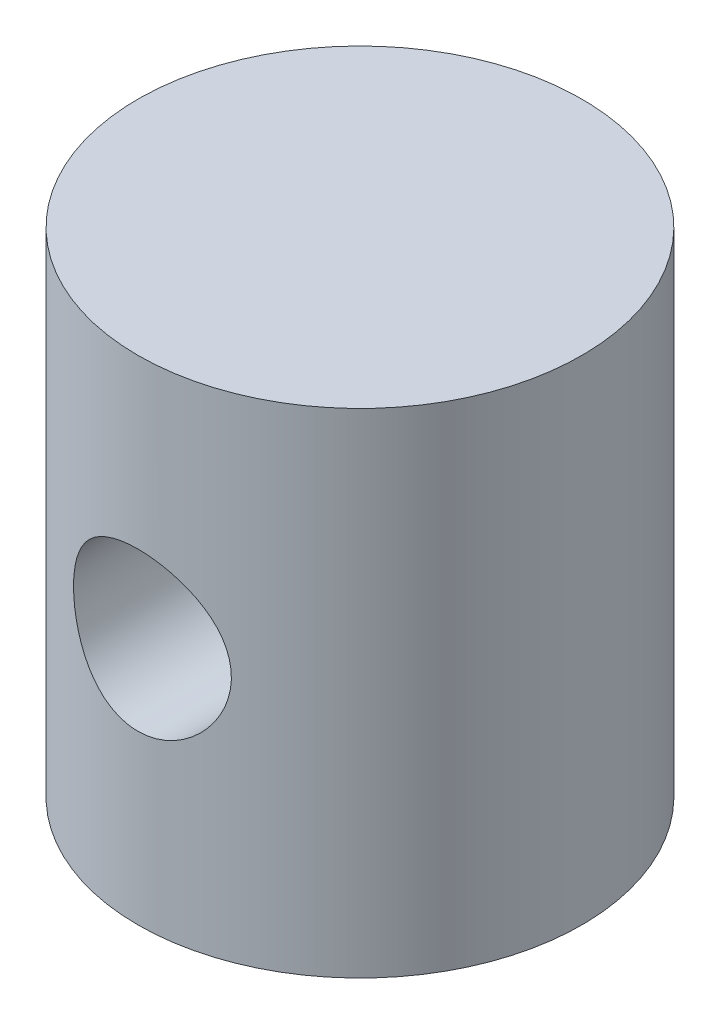
ISO-10303-21;
HEADER;
FILE_DESCRIPTION(('STEP AP214'),'2;1');
FILE_NAME('part.step','',(''),(''),'','','');
FILE_SCHEMA(('AUTOMOTIVE_DESIGN { 1 0 10303 214 1 1 1 1 }'));
ENDSEC;
DATA;
#1=APPLICATION_CONTEXT('core data for automotive mechanical design processes');
#2=APPLICATION_PROTOCOL_DEFINITION('international standard','automotive_design',2000,#1);
#3=PRODUCT_CONTEXT('',#1,'mechanical');
#4=PRODUCT('Part','Part','',(#3));
#5=PRODUCT_RELATED_PRODUCT_CATEGORY('part','',(#4));
#6=PRODUCT_DEFINITION_FORMATION('','',#4);
#7=PRODUCT_DEFINITION_CONTEXT('part definition',#1,'design');
#8=PRODUCT_DEFINITION('design','',#6,#7);
#9=PRODUCT_DEFINITION_SHAPE('','',#8);
#10=(LENGTH_UNIT() NAMED_UNIT(*) SI_UNIT(.MILLI.,.METRE.));
#11=(NAMED_UNIT(*) PLANE_ANGLE_UNIT() SI_UNIT($,.RADIAN.));
#12=(NAMED_UNIT(*) SI_UNIT($,.STERADIAN.) SOLID_ANGLE_UNIT());
#13=UNCERTAINTY_MEASURE_WITH_UNIT(LENGTH_MEASURE(1.E-05),#10,'distance_accuracy_value','');
#14=(GEOMETRIC_REPRESENTATION_CONTEXT(3) GLOBAL_UNCERTAINTY_ASSIGNED_CONTEXT((#13)) GLOBAL_UNIT_ASSIGNED_CONTEXT((#10,
#11,#12)) REPRESENTATION_CONTEXT('',''));
#15=CARTESIAN_POINT('',(0.,0.,0.));
#16=DIRECTION('',(0.,0.,1.));
#17=DIRECTION('',(1.,0.,0.));
#18=AXIS2_PLACEMENT_3D('',#15,#16,#17);
#19=CARTESIAN_POINT('',(0.,10.,0.));
#20=DIRECTION('',(0.,-1.,0.));
#21=DIRECTION('',(0.,0.,-1.));
#22=AXIS2_PLACEMENT_3D('',#19,#20,#21);
#23=CYLINDRICAL_SURFACE('',#22,4.5);
#24=CARTESIAN_POINT('',(0.,6.6,-4.5));
#25=CARTESIAN_POINT('',(-0.086962367001016,6.60000170331781,-4.50000121831381));
#26=CARTESIAN_POINT('',(-0.173912594986548,6.59288756464758,-4.49745660218462));
#27=CARTESIAN_POINT('',(-0.345232042730816,6.56472052458813,-4.48755808036336));
#28=CARTESIAN_POINT('',(-0.429601336499045,6.54366802328069,-4.48020431271152));
#29=CARTESIAN_POINT('',(-0.593264268083103,6.48845103202088,-4.46148154327846));
#30=CARTESIAN_POINT('',(-0.672566778801104,6.45431023971096,-4.45011980128102));
#31=CARTESIAN_POINT('',(-0.824317203344214,6.37399991762724,-4.42452601410756));
#32=CARTESIAN_POINT('',(-0.896763487837446,6.32782753837109,-4.41029328916733));
#33=CARTESIAN_POINT('',(-1.03555325603972,6.22289019225377,-4.37982378915437));
#34=CARTESIAN_POINT('',(-1.10159500304409,6.16374155564854,-4.36353436231253));
#35=CARTESIAN_POINT('',(-1.22305889816077,6.03534558248293,-4.33106075441773));
#36=CARTESIAN_POINT('',(-1.27847825467449,5.96609559965348,-4.31487660210787));
#37=CARTESIAN_POINT('',(-1.37894735362518,5.81662639239243,-4.28384961832896));
#38=CARTESIAN_POINT('',(-1.42358728446997,5.73611730849917,-4.26906992427759));
#39=CARTESIAN_POINT('',(-1.49856138439723,5.56812467914551,-4.24333556181675));
#40=CARTESIAN_POINT('',(-1.52890061337281,5.48064361334812,-4.23237954086694));
#41=CARTESIAN_POINT('',(-1.57324906446977,5.30464586475907,-4.2160917852771));
#42=CARTESIAN_POINT('',(-1.58782943631511,5.21629181674756,-4.21056405508782));
#43=CARTESIAN_POINT('',(-1.60203228750589,5.03823163484607,-4.2051820306007));
#44=CARTESIAN_POINT('',(-1.60166016959616,4.94852600103249,-4.20532568707491));
#45=CARTESIAN_POINT('',(-1.58640851384504,4.7753585721515,-4.21109987539959));
#46=CARTESIAN_POINT('',(-1.57229791673554,4.6918176132264,-4.21643957672627));
#47=CARTESIAN_POINT('',(-1.53123297092066,4.52837726364304,-4.2315244411032));
#48=CARTESIAN_POINT('',(-1.50427688290101,4.44847836773565,-4.24127020073652));
#49=CARTESIAN_POINT('',(-1.43782579513781,4.29293746307933,-4.26425929199336));
#50=CARTESIAN_POINT('',(-1.39811793469731,4.2173954459159,-4.27756130513334));
#51=CARTESIAN_POINT('',(-1.30743843387846,4.07381412236578,-4.30614213416086));
#52=CARTESIAN_POINT('',(-1.25646319561118,4.00577722293283,-4.32142158083326));
#53=CARTESIAN_POINT('',(-1.14109402593671,3.87484907602646,-4.35335395701307));
#54=CARTESIAN_POINT('',(-1.07607898965369,3.81251057916626,-4.37003432126594));
#55=CARTESIAN_POINT('',(-0.936318110171581,3.69946652850783,-4.40209528967428));
#56=CARTESIAN_POINT('',(-0.861571060296905,3.64876241941831,-4.4174757322614));
#57=CARTESIAN_POINT('',(-0.703172757258101,3.55989776250719,-4.44545705385111));
#58=CARTESIAN_POINT('',(-0.619420862134481,3.52190393553156,-4.45802032597115));
#59=CARTESIAN_POINT('',(-0.446158207768305,3.4607228273291,-4.4786760020907));
#60=CARTESIAN_POINT('',(-0.356649753061829,3.43752966103928,-4.48677018292484));
#61=CARTESIAN_POINT('',(-0.179080086355905,3.40763065755325,-4.49727193760944));
#62=CARTESIAN_POINT('',(-0.0911594546857625,3.40017929778181,-4.49993642495249));
#63=CARTESIAN_POINT('',(0.0847051126548785,3.39982721115923,-4.5000612607937));
#64=CARTESIAN_POINT('',(0.172649040398509,3.40692363727449,-4.497522627554));
#65=CARTESIAN_POINT('',(0.342956698657038,3.43488713581159,-4.48769627003348));
#66=CARTESIAN_POINT('',(0.425408569377398,3.45528066095836,-4.48057196256878));
#67=CARTESIAN_POINT('',(0.585674880346524,3.50865111542117,-4.46245382627508));
#68=CARTESIAN_POINT('',(0.663488717336316,3.54162967753414,-4.45145949535923));
#69=CARTESIAN_POINT('',(0.814713352770924,3.62025047029357,-4.42631744558094));
#70=CARTESIAN_POINT('',(0.887939045073109,3.66622243366337,-4.41208981561403));
#71=CARTESIAN_POINT('',(1.02586970337754,3.7691458037341,-4.38207507254957));
#72=CARTESIAN_POINT('',(1.09057175420564,3.8261009504741,-4.36628742912526));
#73=CARTESIAN_POINT('',(1.21312990509652,3.95286811428962,-4.3338832239888));
#74=CARTESIAN_POINT('',(1.27045498047472,4.0231947232227,-4.31726625315894));
#75=CARTESIAN_POINT('',(1.3725761210907,4.17281342644285,-4.28589517721164));
#76=CARTESIAN_POINT('',(1.4173716144124,4.25210592974864,-4.27114115714594));
#77=CARTESIAN_POINT('',(1.49306916121351,4.41773073809579,-4.2452744332402));
#78=CARTESIAN_POINT('',(1.52395972801133,4.50406879408904,-4.23416474198085));
#79=CARTESIAN_POINT('',(1.57059074362003,4.68121813439334,-4.21709299668244));
#80=CARTESIAN_POINT('',(1.58633930297144,4.77202699656596,-4.21112818705763));
#81=CARTESIAN_POINT('',(1.60155614806885,4.94985295593329,-4.20536295551449));
#82=CARTESIAN_POINT('',(1.60191817365802,5.03678334313195,-4.20522413249962));
#83=CARTESIAN_POINT('',(1.58859839205717,5.20939554329224,-4.21027371635439));
#84=CARTESIAN_POINT('',(1.57491765838076,5.2950774511874,-4.21546171600944));
#85=CARTESIAN_POINT('',(1.53456799781577,5.46063625663519,-4.23031235758238));
#86=CARTESIAN_POINT('',(1.50822732561335,5.54060416030704,-4.23986162235417));
#87=CARTESIAN_POINT('',(1.44358264585246,5.6950405678954,-4.26230386023507));
#88=CARTESIAN_POINT('',(1.4052757734027,5.76950774957034,-4.27519763394524));
#89=CARTESIAN_POINT('',(1.31562884842191,5.91474113623593,-4.30365324175367));
#90=CARTESIAN_POINT('',(1.26374777312122,5.9851538250952,-4.31931399837936));
#91=CARTESIAN_POINT('',(1.14929898892771,6.11656102867347,-4.35116495734765));
#92=CARTESIAN_POINT('',(1.08672806305262,6.1775526976979,-4.36735531787884));
#93=CARTESIAN_POINT('',(0.949181146379738,6.2912708749484,-4.39934777835563));
#94=CARTESIAN_POINT('',(0.873762823573343,6.343479498348,-4.41509658876227));
#95=CARTESIAN_POINT('',(0.714681700869576,6.43444130567145,-4.44361911922008));
#96=CARTESIAN_POINT('',(0.631019631369386,6.47319568027003,-4.45639310250468));
#97=CARTESIAN_POINT('',(0.457688306264816,6.53590967274618,-4.47751505779867));
#98=CARTESIAN_POINT('',(0.368014147922614,6.5598570490739,-4.48585936681168));
#99=CARTESIAN_POINT('',(0.185554587943245,6.59189828095846,-4.49710014919912));
#100=CARTESIAN_POINT('',(0.0927703866528561,6.59999818292145,-4.49999870031777));
#101=CARTESIAN_POINT('',(0.,6.6,-4.5));
#102=B_SPLINE_CURVE_WITH_KNOTS('',3,(#24,#25,#26,#27,#28,#29,#30,#31,#32,#33,#34,#35,#36,#37,
#38,#39,#40,#41,#42,#43,#44,#45,#46,#47,#48,#49,#50,#51,#52,#53,#54,#55,#56,#57,#58,#59,#60,#61,
#62,#63,#64,#65,#66,#67,#68,#69,#70,#71,#72,#73,#74,#75,#76,#77,#78,#79,#80,#81,#82,#83,#84,#85,
#86,#87,#88,#89,#90,#91,#92,#93,#94,#95,#96,#97,#98,#99,#100,#101),.UNSPECIFIED.,.T.,.F.,(4,2,2,
2,2,2,2,2,2,2,2,2,2,2,2,2,2,2,2,2,2,2,2,2,2,2,2,2,2,2,2,2,2,2,2,2,2,2,4),(0.,0.260545284000779,
0.52108308972727,0.781151377145635,1.04128131350483,1.31050163799851,1.57979261774685,
1.85810934153977,2.13632751688785,2.40408401837842,2.67174377296839,2.92523592001048,
3.17876240033281,3.43676244883357,3.69484500100059,3.96839463513752,4.24197821914181,
4.51902127010335,4.79595409400123,5.05944705412954,5.32288845303024,5.57742567704985,
5.83199593625023,6.09371782628639,6.35552899682504,6.63095590843878,6.90639538993568,
7.18206199274988,7.45758085737549,7.71707268480253,7.97654467657924,8.22962480490778,
8.48276557098748,8.74815707432138,9.0136285851819,9.29147642066004,9.56929966087592,
9.84735228286192,10.1252987966343),.UNSPECIFIED.);
#103=CARTESIAN_POINT('',(0.,6.6,-4.5));
#104=VERTEX_POINT('',#103);
#105=EDGE_CURVE('E55',#104,#104,#102,.T.);
#106=ORIENTED_EDGE('',*,*,#105,.T.);
#107=EDGE_LOOP('',(#106));
#108=FACE_BOUND('',#107,.T.);
#109=CARTESIAN_POINT('',(0.,10.,0.));
#110=DIRECTION('',(0.,1.,0.));
#111=DIRECTION('',(0.,0.,1.));
#112=AXIS2_PLACEMENT_3D('',#109,#110,#111);
#113=CIRCLE('',#112,4.5);
#114=CARTESIAN_POINT('',(0.,10.,4.5));
#115=VERTEX_POINT('',#114);
#116=EDGE_CURVE('E10',#115,#115,#113,.T.);
#117=ORIENTED_EDGE('',*,*,#116,.F.);
#118=EDGE_LOOP('',(#117));
#119=FACE_BOUND('',#118,.T.);
#120=CARTESIAN_POINT('',(0.,0.,0.));
#121=DIRECTION('',(0.,1.,0.));
#122=DIRECTION('',(0.,0.,1.));
#123=AXIS2_PLACEMENT_3D('',#120,#121,#122);
#124=CIRCLE('',#123,4.5);
#125=CARTESIAN_POINT('',(0.,0.,4.5));
#126=VERTEX_POINT('',#125);
#127=EDGE_CURVE('E50',#126,#126,#124,.T.);
#128=ORIENTED_EDGE('',*,*,#127,.T.);
#129=EDGE_LOOP('',(#128));
#130=FACE_BOUND('',#129,.T.);
#131=CARTESIAN_POINT('',(-1.6,5.,4.20594816896262));
#132=CARTESIAN_POINT('',(-1.60000176653876,4.91323426282831,4.2059466325233));
#133=CARTESIAN_POINT('',(-1.59291854303746,4.82648076753901,4.20866230317316));
#134=CARTESIAN_POINT('',(-1.56488549388392,4.65556782115211,4.21916503629978));
#135=CARTESIAN_POINT('',(-1.54393488065575,4.57140851767154,4.22695238681397));
#136=CARTESIAN_POINT('',(-1.48901532580341,4.40819300086988,4.24660725999297));
#137=CARTESIAN_POINT('',(-1.45507479717298,4.3291260868079,4.25846587175186));
#138=CARTESIAN_POINT('',(-1.37523793238815,4.17777985879535,4.28491342753786));
#139=CARTESIAN_POINT('',(-1.32933842782722,4.10550235054209,4.29950309484093));
#140=CARTESIAN_POINT('',(-1.22469397197854,3.96656342045125,4.33049821715604));
#141=CARTESIAN_POINT('',(-1.16550386227185,3.90024826034116,4.34695329506707));
#142=CARTESIAN_POINT('',(-1.03690554397058,3.77824515816139,4.37940865052658));
#143=CARTESIAN_POINT('',(-0.96749543137793,3.7225592007729,4.39540884266521));
#144=CARTESIAN_POINT('',(-0.81784537824592,3.62177419302495,4.42573409720288));
#145=CARTESIAN_POINT('',(-0.73734199379503,3.57704499957832,4.43999410197754));
#146=CARTESIAN_POINT('',(-0.569357946732584,3.5019046294465,4.46464150404038));
#147=CARTESIAN_POINT('',(-0.481879452160409,3.47148902387014,4.47503009900766));
#148=CARTESIAN_POINT('',(-0.306064086351643,3.42703421399072,4.49041230463715));
#149=CARTESIAN_POINT('',(-0.217895003496383,3.41240030586795,4.49560126712181));
#150=CARTESIAN_POINT('',(-0.0402101033913108,3.39802577950272,4.50069695820355));
#151=CARTESIAN_POINT('',(0.0493053121862013,3.39828080399948,4.50060523219942));
#152=CARTESIAN_POINT('',(0.22290495965723,3.41331569739007,4.49527806524339));
#153=CARTESIAN_POINT('',(0.307053497675671,3.4274480261225,4.4902719419118));
#154=CARTESIAN_POINT('',(0.471695779950199,3.46875598140396,4.47597306722529));
#155=CARTESIAN_POINT('',(0.552189268981258,3.49593251727642,4.46668001702659));
#156=CARTESIAN_POINT('',(0.708565539356494,3.56289445625312,4.44457683482582));
#157=CARTESIAN_POINT('',(0.784368197988854,3.60285070479291,4.43171938190803));
#158=CARTESIAN_POINT('',(0.928372679166685,3.69409200933397,4.40380656130014));
#159=CARTESIAN_POINT('',(0.996572188915132,3.74538049841175,4.38875052802483));
#160=CARTESIAN_POINT('',(1.12726941265176,3.8610203126819,4.35706614584535));
#161=CARTESIAN_POINT('',(1.1892722210196,3.92592056928342,4.34039675880494));
#162=CARTESIAN_POINT('',(1.30168812080593,4.06531947092054,4.30802023964381));
#163=CARTESIAN_POINT('',(1.35209887656043,4.13982004559848,4.29231330191229));
#164=CARTESIAN_POINT('',(1.4407164863627,4.29807084785238,4.26339726836409));
#165=CARTESIAN_POINT('',(1.47868487992806,4.38196457914471,4.25023875982108));
#166=CARTESIAN_POINT('',(1.53977696586342,4.55554396451463,4.22849275530212));
#167=CARTESIAN_POINT('',(1.56290792408896,4.64522675998343,4.21990302236055));
#168=CARTESIAN_POINT('',(1.59259987609534,4.82299116017478,4.20878436155374));
#169=CARTESIAN_POINT('',(1.599938346667,4.91092507733671,4.20597138454346));
#170=CARTESIAN_POINT('',(1.60006084059022,5.08679387629433,4.20592526250886));
#171=CARTESIAN_POINT('',(1.5928479980256,5.17472875380396,4.20869091595066));
#172=CARTESIAN_POINT('',(1.56477477747803,5.34433850449755,4.21920440878006));
#173=CARTESIAN_POINT('',(1.54448538518019,5.42612226506307,4.2267435811876));
#174=CARTESIAN_POINT('',(1.49153731182258,5.58509788139652,4.24571569518896));
#175=CARTESIAN_POINT('',(1.45887625520133,5.66228885197801,4.25714938455108));
#176=CARTESIAN_POINT('',(1.38082408078295,5.81287572892673,4.28311428356285));
#177=CARTESIAN_POINT('',(1.33502880420585,5.88604546583477,4.29773959575628));
#178=CARTESIAN_POINT('',(1.23245127572623,6.023940409037,4.32827026027054));
#179=CARTESIAN_POINT('',(1.17566536692775,6.08866279262185,4.34417603760685));
#180=CARTESIAN_POINT('',(1.04895384178491,6.21157460727323,4.37655106164894));
#181=CARTESIAN_POINT('',(0.978470952986764,6.26919617929677,4.39300206653244));
#182=CARTESIAN_POINT('',(0.828430051411222,6.37184694046426,4.42374953260242));
#183=CARTESIAN_POINT('',(0.748872204128967,6.41687635919287,4.43804603306841));
#184=CARTESIAN_POINT('',(0.583179723822161,6.49270057384014,4.46283245956967));
#185=CARTESIAN_POINT('',(0.497081838670386,6.52356891041073,4.47334198935967));
#186=CARTESIAN_POINT('',(0.320462563958086,6.57023476087969,4.48944893555702));
#187=CARTESIAN_POINT('',(0.229943035237845,6.58603855818543,4.49504839987068));
#188=CARTESIAN_POINT('',(0.0522106120370195,6.6015016350738,4.50052895830501));
#189=CARTESIAN_POINT('',(-0.0349236110127856,6.60197138370821,4.50069711468001));
#190=CARTESIAN_POINT('',(-0.20797269413384,6.58879676601807,4.49602458744543));
#191=CARTESIAN_POINT('',(-0.293887676224897,6.57515382231355,4.49118440869754));
#192=CARTESIAN_POINT('',(-0.460318849771979,6.53469752023003,4.47715852799092));
#193=CARTESIAN_POINT('',(-0.540908883445951,6.50815466054012,4.4680622130594));
#194=CARTESIAN_POINT('',(-0.696511100383458,6.44291155102766,4.44646479553111));
#195=CARTESIAN_POINT('',(-0.771522236842401,6.40420902669031,4.43396305599403));
#196=CARTESIAN_POINT('',(-0.917104608147531,6.31397982266331,4.40620368815907));
#197=CARTESIAN_POINT('',(-0.987379726148115,6.26200349786353,4.39085607935692));
#198=CARTESIAN_POINT('',(-1.11846844464826,6.14743699418361,4.35930983262607));
#199=CARTESIAN_POINT('',(-1.17927881177039,6.08484320332651,4.34311090638464));
#200=CARTESIAN_POINT('',(-1.29258553896772,5.94737295049359,4.31078383381187));
#201=CARTESIAN_POINT('',(-1.34456840125154,5.87206282098585,4.2946934875441));
#202=CARTESIAN_POINT('',(-1.43513154115348,5.71326623970469,4.26528713327712));
#203=CARTESIAN_POINT('',(-1.47371291152588,5.62978045528407,4.25197089911296));
#204=CARTESIAN_POINT('',(-1.53615714900875,5.45681156384301,4.22981442205812));
#205=CARTESIAN_POINT('',(-1.56000935101059,5.36732416302126,4.22097742332361));
#206=CARTESIAN_POINT('',(-1.59192596833137,5.18521882297485,4.20904652279639));
#207=CARTESIAN_POINT('',(-1.59999811462677,5.09260243934036,4.20594980875769));
#208=CARTESIAN_POINT('',(-1.6,5.,4.20594816896262));
#209=B_SPLINE_CURVE_WITH_KNOTS('',3,(#131,#132,#133,#134,#135,#136,#137,#138,#139,#140,#141,
#142,#143,#144,#145,#146,#147,#148,#149,#150,#151,#152,#153,#154,#155,#156,#157,#158,#159,#160,
#161,#162,#163,#164,#165,#166,#167,#168,#169,#170,#171,#172,#173,#174,#175,#176,#177,#178,#179,
#180,#181,#182,#183,#184,#185,#186,#187,#188,#189,#190,#191,#192,#193,#194,#195,#196,#197,#198,
#199,#200,#201,#202,#203,#204,#205,#206,#207,#208),.UNSPECIFIED.,.T.,.F.,(4,2,2,2,2,2,2,2,2,2,2,
2,2,2,2,2,2,2,2,2,2,2,2,2,2,2,2,2,2,2,2,2,2,2,2,2,2,2,4),(0.,0.259953291970315,
0.519921348833398,0.779323994607175,1.03879543642786,1.30878128533634,1.57881749670462,
1.85699611078511,2.13508859452633,2.40229005360034,2.66941331629628,2.92463711542367,
3.17987870901695,3.43868609999424,3.69757200384698,3.97020163398208,4.24288614778309,
4.52052674832307,4.79803128494058,5.06152801645348,5.32496800170101,5.57761967779331,
5.83031989174368,6.09183114994743,6.3534295704366,6.62965935621094,6.90588410533624,
7.18065767081423,7.45531657824236,7.7154337013378,7.97552460606453,8.23038272661511,
8.48528854782629,8.75035401487215,9.01550983658237,9.29290814086468,9.57028382084661,
9.84786010846342,10.1253003715868),.UNSPECIFIED.);
#210=CARTESIAN_POINT('',(-1.6,5.,4.20594816896262));
#211=VERTEX_POINT('',#210);
#212=EDGE_CURVE('E42',#211,#211,#209,.T.);
#213=ORIENTED_EDGE('',*,*,#212,.F.);
#214=EDGE_LOOP('',(#213));
#215=FACE_BOUND('',#214,.T.);
#216=ADVANCED_FACE('F38',(#108,#119,#130,#215),#23,.T.);
#217=CARTESIAN_POINT('',(0.,10.,0.));
#218=DIRECTION('',(0.,1.,0.));
#219=DIRECTION('',(0.,0.,1.));
#220=AXIS2_PLACEMENT_3D('',#217,#218,#219);
#221=PLANE('',#220);
#222=ORIENTED_EDGE('',*,*,#116,.T.);
#223=EDGE_LOOP('',(#222));
#224=FACE_BOUND('',#223,.T.);
#225=ADVANCED_FACE('F69',(#224),#221,.T.);
#226=CARTESIAN_POINT('',(0.,0.,0.));
#227=DIRECTION('',(0.,1.,0.));
#228=DIRECTION('',(0.,0.,1.));
#229=AXIS2_PLACEMENT_3D('',#226,#227,#228);
#230=PLANE('',#229);
#231=ORIENTED_EDGE('',*,*,#127,.F.);
#232=EDGE_LOOP('',(#231));
#233=FACE_BOUND('',#232,.T.);
#234=ADVANCED_FACE('F66',(#233),#230,.F.);
#235=CARTESIAN_POINT('',(0.,5.,-10.));
#236=DIRECTION('',(0.,0.,1.));
#237=DIRECTION('',(1.,0.,0.));
#238=AXIS2_PLACEMENT_3D('',#235,#236,#237);
#239=CYLINDRICAL_SURFACE('',#238,1.6);
#240=ORIENTED_EDGE('',*,*,#105,.F.);
#241=EDGE_LOOP('',(#240));
#242=FACE_BOUND('',#241,.T.);
#243=ORIENTED_EDGE('',*,*,#212,.T.);
#244=EDGE_LOOP('',(#243));
#245=FACE_BOUND('',#244,.T.);
#246=ADVANCED_FACE('F62',(#242,#245),#239,.F.);
#247=CLOSED_SHELL('',(#216,#225,#234,#246));
#248=MANIFOLD_SOLID_BREP('B2',#247);
#249=ADVANCED_BREP_SHAPE_REPRESENTATION('',(#18,#248),#14);
#250=SHAPE_DEFINITION_REPRESENTATION(#9,#249);
ENDSEC;
END-ISO-10303-21;
